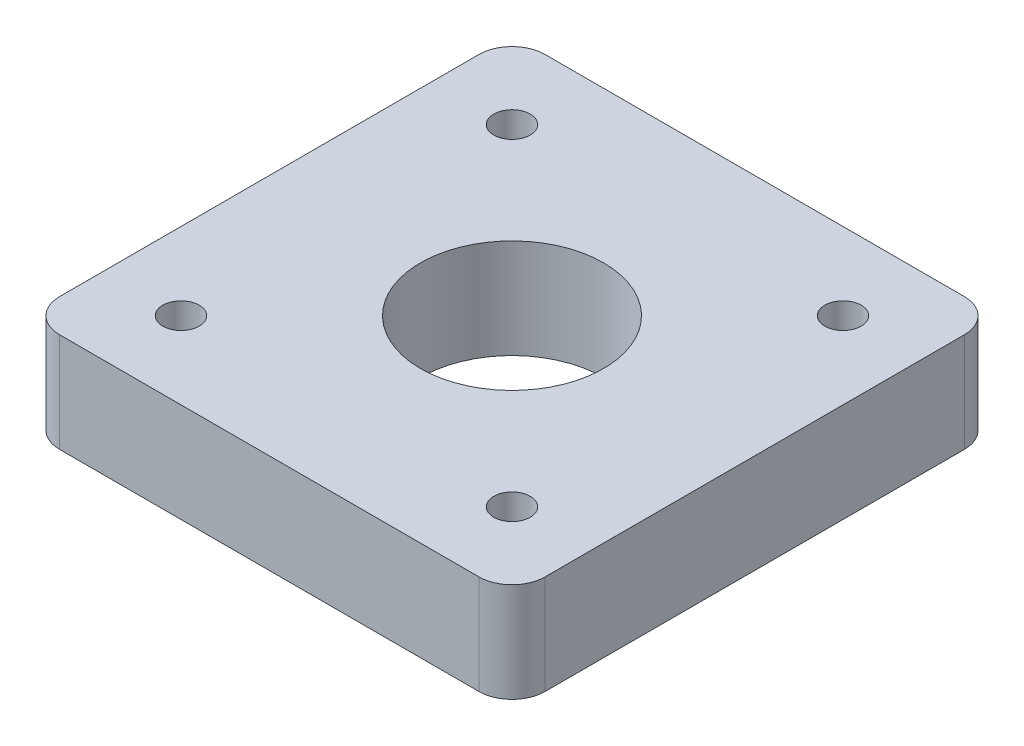
ISO-10303-21;
HEADER;
FILE_DESCRIPTION(('STEP AP214'),'2;1');
FILE_NAME('part.step','',(''),(''),'','','');
FILE_SCHEMA(('AUTOMOTIVE_DESIGN { 1 0 10303 214 1 1 1 1 }'));
ENDSEC;
DATA;
#1=APPLICATION_CONTEXT('core data for automotive mechanical design processes');
#2=APPLICATION_PROTOCOL_DEFINITION('international standard','automotive_design',2000,#1);
#3=PRODUCT_CONTEXT('',#1,'mechanical');
#4=PRODUCT('Part','Part','',(#3));
#5=PRODUCT_RELATED_PRODUCT_CATEGORY('part','',(#4));
#6=PRODUCT_DEFINITION_FORMATION('','',#4);
#7=PRODUCT_DEFINITION_CONTEXT('part definition',#1,'design');
#8=PRODUCT_DEFINITION('design','',#6,#7);
#9=PRODUCT_DEFINITION_SHAPE('','',#8);
#10=(LENGTH_UNIT() NAMED_UNIT(*) SI_UNIT(.MILLI.,.METRE.));
#11=(NAMED_UNIT(*) PLANE_ANGLE_UNIT() SI_UNIT($,.RADIAN.));
#12=(NAMED_UNIT(*) SI_UNIT($,.STERADIAN.) SOLID_ANGLE_UNIT());
#13=UNCERTAINTY_MEASURE_WITH_UNIT(LENGTH_MEASURE(1.E-05),#10,'distance_accuracy_value','');
#14=(GEOMETRIC_REPRESENTATION_CONTEXT(3) GLOBAL_UNCERTAINTY_ASSIGNED_CONTEXT((#13)) GLOBAL_UNIT_ASSIGNED_CONTEXT((#10,
#11,#12)) REPRESENTATION_CONTEXT('',''));
#15=CARTESIAN_POINT('',(0.,0.,0.));
#16=DIRECTION('',(0.,0.,1.));
#17=DIRECTION('',(1.,0.,0.));
#18=AXIS2_PLACEMENT_3D('',#15,#16,#17);
#19=CARTESIAN_POINT('',(0.,9.,44.));
#20=DIRECTION('',(1.,0.,0.));
#21=DIRECTION('',(0.,0.,-1.));
#22=AXIS2_PLACEMENT_3D('',#19,#20,#21);
#23=PLANE('',#22);
#24=DIRECTION('',(0.,0.,-1.));
#25=VECTOR('',#24,1.);
#26=CARTESIAN_POINT('',(0.,9.,44.));
#27=LINE('',#26,#25);
#28=CARTESIAN_POINT('',(0.,9.,41.));
#29=VERTEX_POINT('',#28);
#30=CARTESIAN_POINT('',(0.,9.,3.));
#31=VERTEX_POINT('',#30);
#32=EDGE_CURVE('E160',#29,#31,#27,.T.);
#33=ORIENTED_EDGE('',*,*,#32,.T.);
#34=DIRECTION('',(0.,-1.,0.));
#35=VECTOR('',#34,1.);
#36=CARTESIAN_POINT('',(0.,9.,3.));
#37=LINE('',#36,#35);
#38=CARTESIAN_POINT('',(0.,0.,3.));
#39=VERTEX_POINT('',#38);
#40=EDGE_CURVE('E124',#31,#39,#37,.T.);
#41=ORIENTED_EDGE('',*,*,#40,.T.);
#42=DIRECTION('',(0.,0.,-1.));
#43=VECTOR('',#42,1.);
#44=CARTESIAN_POINT('',(0.,0.,44.));
#45=LINE('',#44,#43);
#46=CARTESIAN_POINT('',(0.,0.,41.));
#47=VERTEX_POINT('',#46);
#48=EDGE_CURVE('E109',#47,#39,#45,.T.);
#49=ORIENTED_EDGE('',*,*,#48,.F.);
#50=DIRECTION('',(0.,-1.,0.));
#51=VECTOR('',#50,1.);
#52=CARTESIAN_POINT('',(0.,9.,41.));
#53=LINE('',#52,#51);
#54=EDGE_CURVE('E121',#47,#29,#53,.F.);
#55=ORIENTED_EDGE('',*,*,#54,.T.);
#56=EDGE_LOOP('',(#33,#41,#49,#55));
#57=FACE_BOUND('',#56,.T.);
#58=ADVANCED_FACE('F39',(#57),#23,.F.);
#59=CARTESIAN_POINT('',(0.,0.,44.));
#60=DIRECTION('',(0.,1.,0.));
#61=DIRECTION('',(0.,0.,1.));
#62=AXIS2_PLACEMENT_3D('',#59,#60,#61);
#63=PLANE('',#62);
#64=CARTESIAN_POINT('',(37.,0.,37.));
#65=DIRECTION('',(0.,1.,0.));
#66=DIRECTION('',(0.,0.,1.));
#67=AXIS2_PLACEMENT_3D('',#64,#65,#66);
#68=CIRCLE('',#67,1.65);
#69=CARTESIAN_POINT('',(37.,0.,38.65));
#70=VERTEX_POINT('',#69);
#71=EDGE_CURVE('E351',#70,#70,#68,.T.);
#72=ORIENTED_EDGE('',*,*,#71,.T.);
#73=EDGE_LOOP('',(#72));
#74=FACE_BOUND('',#73,.T.);
#75=CARTESIAN_POINT('',(37.,0.,7.));
#76=DIRECTION('',(0.,1.,0.));
#77=DIRECTION('',(0.,0.,1.));
#78=AXIS2_PLACEMENT_3D('',#75,#76,#77);
#79=CIRCLE('',#78,1.65);
#80=CARTESIAN_POINT('',(37.,0.,8.65));
#81=VERTEX_POINT('',#80);
#82=EDGE_CURVE('E359',#81,#81,#79,.T.);
#83=ORIENTED_EDGE('',*,*,#82,.T.);
#84=EDGE_LOOP('',(#83));
#85=FACE_BOUND('',#84,.T.);
#86=CARTESIAN_POINT('',(7.,0.,37.));
#87=DIRECTION('',(0.,1.,0.));
#88=DIRECTION('',(0.,0.,1.));
#89=AXIS2_PLACEMENT_3D('',#86,#87,#88);
#90=CIRCLE('',#89,1.65);
#91=CARTESIAN_POINT('',(7.,0.,38.65));
#92=VERTEX_POINT('',#91);
#93=EDGE_CURVE('E365',#92,#92,#90,.T.);
#94=ORIENTED_EDGE('',*,*,#93,.T.);
#95=EDGE_LOOP('',(#94));
#96=FACE_BOUND('',#95,.T.);
#97=CARTESIAN_POINT('',(7.,0.,7.));
#98=DIRECTION('',(0.,1.,0.));
#99=DIRECTION('',(0.,0.,1.));
#100=AXIS2_PLACEMENT_3D('',#97,#98,#99);
#101=CIRCLE('',#100,1.65);
#102=CARTESIAN_POINT('',(7.,0.,8.65));
#103=VERTEX_POINT('',#102);
#104=EDGE_CURVE('E371',#103,#103,#101,.T.);
#105=ORIENTED_EDGE('',*,*,#104,.T.);
#106=EDGE_LOOP('',(#105));
#107=FACE_BOUND('',#106,.T.);
#108=CARTESIAN_POINT('',(22.,0.,22.));
#109=DIRECTION('',(0.,1.,0.));
#110=DIRECTION('',(0.,0.,1.));
#111=AXIS2_PLACEMENT_3D('',#108,#109,#110);
#112=CIRCLE('',#111,8.3);
#113=CARTESIAN_POINT('',(22.,0.,30.3));
#114=VERTEX_POINT('',#113);
#115=EDGE_CURVE('E171',#114,#114,#112,.T.);
#116=ORIENTED_EDGE('',*,*,#115,.T.);
#117=EDGE_LOOP('',(#116));
#118=FACE_BOUND('',#117,.T.);
#119=ORIENTED_EDGE('',*,*,#48,.T.);
#120=CARTESIAN_POINT('',(3.,0.,3.));
#121=DIRECTION('',(0.,1.,0.));
#122=DIRECTION('',(0.,0.,1.));
#123=AXIS2_PLACEMENT_3D('',#120,#121,#122);
#124=CIRCLE('',#123,3.);
#125=CARTESIAN_POINT('',(3.,0.,0.));
#126=VERTEX_POINT('',#125);
#127=EDGE_CURVE('E136',#39,#126,#124,.F.);
#128=ORIENTED_EDGE('',*,*,#127,.T.);
#129=DIRECTION('',(1.,0.,0.));
#130=VECTOR('',#129,1.);
#131=CARTESIAN_POINT('',(0.,0.,0.));
#132=LINE('',#131,#130);
#133=CARTESIAN_POINT('',(41.,0.,0.));
#134=VERTEX_POINT('',#133);
#135=EDGE_CURVE('E168',#126,#134,#132,.T.);
#136=ORIENTED_EDGE('',*,*,#135,.T.);
#137=CARTESIAN_POINT('',(41.,0.,3.));
#138=DIRECTION('',(0.,1.,0.));
#139=DIRECTION('',(0.,0.,1.));
#140=AXIS2_PLACEMENT_3D('',#137,#138,#139);
#141=CIRCLE('',#140,3.);
#142=CARTESIAN_POINT('',(44.,0.,3.));
#143=VERTEX_POINT('',#142);
#144=EDGE_CURVE('E115',#134,#143,#141,.F.);
#145=ORIENTED_EDGE('',*,*,#144,.T.);
#146=DIRECTION('',(0.,0.,-1.));
#147=VECTOR('',#146,1.);
#148=CARTESIAN_POINT('',(44.,0.,44.));
#149=LINE('',#148,#147);
#150=CARTESIAN_POINT('',(44.,0.,41.));
#151=VERTEX_POINT('',#150);
#152=EDGE_CURVE('E125',#151,#143,#149,.T.);
#153=ORIENTED_EDGE('',*,*,#152,.F.);
#154=CARTESIAN_POINT('',(41.,0.,41.));
#155=DIRECTION('',(0.,1.,0.));
#156=DIRECTION('',(0.,0.,1.));
#157=AXIS2_PLACEMENT_3D('',#154,#155,#156);
#158=CIRCLE('',#157,3.);
#159=CARTESIAN_POINT('',(41.,0.,44.));
#160=VERTEX_POINT('',#159);
#161=EDGE_CURVE('E116',#151,#160,#158,.F.);
#162=ORIENTED_EDGE('',*,*,#161,.T.);
#163=DIRECTION('',(1.,0.,0.));
#164=VECTOR('',#163,1.);
#165=CARTESIAN_POINT('',(0.,0.,44.));
#166=LINE('',#165,#164);
#167=CARTESIAN_POINT('',(3.,0.,44.));
#168=VERTEX_POINT('',#167);
#169=EDGE_CURVE('E111',#168,#160,#166,.T.);
#170=ORIENTED_EDGE('',*,*,#169,.F.);
#171=CARTESIAN_POINT('',(3.,0.,41.));
#172=DIRECTION('',(0.,1.,0.));
#173=DIRECTION('',(0.,0.,1.));
#174=AXIS2_PLACEMENT_3D('',#171,#172,#173);
#175=CIRCLE('',#174,3.);
#176=EDGE_CURVE('E106',#168,#47,#175,.F.);
#177=ORIENTED_EDGE('',*,*,#176,.T.);
#178=EDGE_LOOP('',(#119,#128,#136,#145,#153,#162,#170,#177));
#179=FACE_BOUND('',#178,.T.);
#180=ADVANCED_FACE('F108',(#74,#85,#96,#107,#118,#179),#63,.F.);
#181=CARTESIAN_POINT('',(44.,0.,44.));
#182=DIRECTION('',(-1.,0.,0.));
#183=DIRECTION('',(0.,0.,1.));
#184=AXIS2_PLACEMENT_3D('',#181,#182,#183);
#185=PLANE('',#184);
#186=ORIENTED_EDGE('',*,*,#152,.T.);
#187=DIRECTION('',(0.,1.,0.));
#188=VECTOR('',#187,1.);
#189=CARTESIAN_POINT('',(44.,0.,3.));
#190=LINE('',#189,#188);
#191=CARTESIAN_POINT('',(44.,9.,3.));
#192=VERTEX_POINT('',#191);
#193=EDGE_CURVE('E149',#143,#192,#190,.T.);
#194=ORIENTED_EDGE('',*,*,#193,.T.);
#195=DIRECTION('',(0.,0.,-1.));
#196=VECTOR('',#195,1.);
#197=CARTESIAN_POINT('',(44.,9.,44.));
#198=LINE('',#197,#196);
#199=CARTESIAN_POINT('',(44.,9.,41.));
#200=VERTEX_POINT('',#199);
#201=EDGE_CURVE('E162',#200,#192,#198,.T.);
#202=ORIENTED_EDGE('',*,*,#201,.F.);
#203=DIRECTION('',(0.,1.,0.));
#204=VECTOR('',#203,1.);
#205=CARTESIAN_POINT('',(44.,0.,41.));
#206=LINE('',#205,#204);
#207=EDGE_CURVE('E147',#200,#151,#206,.F.);
#208=ORIENTED_EDGE('',*,*,#207,.T.);
#209=EDGE_LOOP('',(#186,#194,#202,#208));
#210=FACE_BOUND('',#209,.T.);
#211=ADVANCED_FACE('F176',(#210),#185,.F.);
#212=CARTESIAN_POINT('',(44.,9.,44.));
#213=DIRECTION('',(0.,-1.,0.));
#214=DIRECTION('',(0.,0.,-1.));
#215=AXIS2_PLACEMENT_3D('',#212,#213,#214);
#216=PLANE('',#215);
#217=CARTESIAN_POINT('',(37.,9.,37.));
#218=DIRECTION('',(0.,1.,0.));
#219=DIRECTION('',(0.,0.,1.));
#220=AXIS2_PLACEMENT_3D('',#217,#218,#219);
#221=CIRCLE('',#220,1.65);
#222=CARTESIAN_POINT('',(37.,9.,38.65));
#223=VERTEX_POINT('',#222);
#224=EDGE_CURVE('E354',#223,#223,#221,.T.);
#225=ORIENTED_EDGE('',*,*,#224,.F.);
#226=EDGE_LOOP('',(#225));
#227=FACE_BOUND('',#226,.T.);
#228=CARTESIAN_POINT('',(37.,9.,7.));
#229=DIRECTION('',(0.,1.,0.));
#230=DIRECTION('',(0.,0.,1.));
#231=AXIS2_PLACEMENT_3D('',#228,#229,#230);
#232=CIRCLE('',#231,1.65);
#233=CARTESIAN_POINT('',(37.,9.,8.65));
#234=VERTEX_POINT('',#233);
#235=EDGE_CURVE('E356',#234,#234,#232,.T.);
#236=ORIENTED_EDGE('',*,*,#235,.F.);
#237=EDGE_LOOP('',(#236));
#238=FACE_BOUND('',#237,.T.);
#239=CARTESIAN_POINT('',(7.,9.,37.));
#240=DIRECTION('',(0.,1.,0.));
#241=DIRECTION('',(0.,0.,1.));
#242=AXIS2_PLACEMENT_3D('',#239,#240,#241);
#243=CIRCLE('',#242,1.65);
#244=CARTESIAN_POINT('',(7.,9.,38.65));
#245=VERTEX_POINT('',#244);
#246=EDGE_CURVE('E362',#245,#245,#243,.T.);
#247=ORIENTED_EDGE('',*,*,#246,.F.);
#248=EDGE_LOOP('',(#247));
#249=FACE_BOUND('',#248,.T.);
#250=CARTESIAN_POINT('',(7.,9.,7.));
#251=DIRECTION('',(0.,1.,0.));
#252=DIRECTION('',(0.,0.,1.));
#253=AXIS2_PLACEMENT_3D('',#250,#251,#252);
#254=CIRCLE('',#253,1.65);
#255=CARTESIAN_POINT('',(7.,9.,8.65));
#256=VERTEX_POINT('',#255);
#257=EDGE_CURVE('E368',#256,#256,#254,.T.);
#258=ORIENTED_EDGE('',*,*,#257,.F.);
#259=EDGE_LOOP('',(#258));
#260=FACE_BOUND('',#259,.T.);
#261=CARTESIAN_POINT('',(22.,9.,22.));
#262=DIRECTION('',(0.,1.,0.));
#263=DIRECTION('',(0.,0.,1.));
#264=AXIS2_PLACEMENT_3D('',#261,#262,#263);
#265=CIRCLE('',#264,8.3);
#266=CARTESIAN_POINT('',(22.,9.,30.3));
#267=VERTEX_POINT('',#266);
#268=EDGE_CURVE('E374',#267,#267,#265,.T.);
#269=ORIENTED_EDGE('',*,*,#268,.F.);
#270=EDGE_LOOP('',(#269));
#271=FACE_BOUND('',#270,.T.);
#272=DIRECTION('',(-1.,0.,0.));
#273=VECTOR('',#272,1.);
#274=CARTESIAN_POINT('',(44.,9.,0.));
#275=LINE('',#274,#273);
#276=CARTESIAN_POINT('',(41.,9.,0.));
#277=VERTEX_POINT('',#276);
#278=CARTESIAN_POINT('',(3.,9.,0.));
#279=VERTEX_POINT('',#278);
#280=EDGE_CURVE('E164',#277,#279,#275,.T.);
#281=ORIENTED_EDGE('',*,*,#280,.T.);
#282=CARTESIAN_POINT('',(3.,9.,3.));
#283=DIRECTION('',(0.,-1.,0.));
#284=DIRECTION('',(0.,0.,-1.));
#285=AXIS2_PLACEMENT_3D('',#282,#283,#284);
#286=CIRCLE('',#285,3.);
#287=EDGE_CURVE('E145',#279,#31,#286,.F.);
#288=ORIENTED_EDGE('',*,*,#287,.T.);
#289=ORIENTED_EDGE('',*,*,#32,.F.);
#290=CARTESIAN_POINT('',(3.,9.,41.));
#291=DIRECTION('',(0.,-1.,0.));
#292=DIRECTION('',(0.,0.,-1.));
#293=AXIS2_PLACEMENT_3D('',#290,#291,#292);
#294=CIRCLE('',#293,3.);
#295=CARTESIAN_POINT('',(3.,9.,44.));
#296=VERTEX_POINT('',#295);
#297=EDGE_CURVE('E129',#29,#296,#294,.F.);
#298=ORIENTED_EDGE('',*,*,#297,.T.);
#299=DIRECTION('',(-1.,0.,0.));
#300=VECTOR('',#299,1.);
#301=CARTESIAN_POINT('',(44.,9.,44.));
#302=LINE('',#301,#300);
#303=CARTESIAN_POINT('',(41.,9.,44.));
#304=VERTEX_POINT('',#303);
#305=EDGE_CURVE('E155',#304,#296,#302,.T.);
#306=ORIENTED_EDGE('',*,*,#305,.F.);
#307=CARTESIAN_POINT('',(41.,9.,41.));
#308=DIRECTION('',(0.,-1.,0.));
#309=DIRECTION('',(0.,0.,-1.));
#310=AXIS2_PLACEMENT_3D('',#307,#308,#309);
#311=CIRCLE('',#310,3.);
#312=EDGE_CURVE('E62',#304,#200,#311,.F.);
#313=ORIENTED_EDGE('',*,*,#312,.T.);
#314=ORIENTED_EDGE('',*,*,#201,.T.);
#315=CARTESIAN_POINT('',(41.,9.,3.));
#316=DIRECTION('',(0.,-1.,0.));
#317=DIRECTION('',(0.,0.,-1.));
#318=AXIS2_PLACEMENT_3D('',#315,#316,#317);
#319=CIRCLE('',#318,3.);
#320=EDGE_CURVE('E54',#192,#277,#319,.F.);
#321=ORIENTED_EDGE('',*,*,#320,.T.);
#322=EDGE_LOOP('',(#281,#288,#289,#298,#306,#313,#314,#321));
#323=FACE_BOUND('',#322,.T.);
#324=ADVANCED_FACE('F159',(#227,#238,#249,#260,#271,#323),#216,.F.);
#325=CARTESIAN_POINT('',(0.,0.,44.));
#326=DIRECTION('',(0.,0.,1.));
#327=DIRECTION('',(1.,0.,0.));
#328=AXIS2_PLACEMENT_3D('',#325,#326,#327);
#329=PLANE('',#328);
#330=ORIENTED_EDGE('',*,*,#305,.T.);
#331=DIRECTION('',(0.,-1.,0.));
#332=VECTOR('',#331,1.);
#333=CARTESIAN_POINT('',(3.,0.,44.));
#334=LINE('',#333,#332);
#335=EDGE_CURVE('E11',#296,#168,#334,.T.);
#336=ORIENTED_EDGE('',*,*,#335,.T.);
#337=ORIENTED_EDGE('',*,*,#169,.T.);
#338=DIRECTION('',(0.,1.,0.));
#339=VECTOR('',#338,1.);
#340=CARTESIAN_POINT('',(41.,9.,44.));
#341=LINE('',#340,#339);
#342=EDGE_CURVE('E47',#160,#304,#341,.T.);
#343=ORIENTED_EDGE('',*,*,#342,.T.);
#344=EDGE_LOOP('',(#330,#336,#337,#343));
#345=FACE_BOUND('',#344,.T.);
#346=ADVANCED_FACE('F154',(#345),#329,.T.);
#347=CARTESIAN_POINT('',(0.,0.,0.));
#348=DIRECTION('',(0.,0.,1.));
#349=DIRECTION('',(1.,0.,0.));
#350=AXIS2_PLACEMENT_3D('',#347,#348,#349);
#351=PLANE('',#350);
#352=ORIENTED_EDGE('',*,*,#135,.F.);
#353=DIRECTION('',(0.,-1.,0.));
#354=VECTOR('',#353,1.);
#355=CARTESIAN_POINT('',(3.,0.,0.));
#356=LINE('',#355,#354);
#357=EDGE_CURVE('E140',#126,#279,#356,.F.);
#358=ORIENTED_EDGE('',*,*,#357,.T.);
#359=ORIENTED_EDGE('',*,*,#280,.F.);
#360=DIRECTION('',(0.,1.,0.));
#361=VECTOR('',#360,1.);
#362=CARTESIAN_POINT('',(41.,0.,0.));
#363=LINE('',#362,#361);
#364=EDGE_CURVE('E138',#277,#134,#363,.F.);
#365=ORIENTED_EDGE('',*,*,#364,.T.);
#366=EDGE_LOOP('',(#352,#358,#359,#365));
#367=FACE_BOUND('',#366,.T.);
#368=ADVANCED_FACE('F183',(#367),#351,.F.);
#369=CARTESIAN_POINT('',(3.,9.,3.));
#370=DIRECTION('',(0.,-1.,0.));
#371=DIRECTION('',(0.,0.,-1.));
#372=AXIS2_PLACEMENT_3D('',#369,#370,#371);
#373=CYLINDRICAL_SURFACE('',#372,3.);
#374=ORIENTED_EDGE('',*,*,#287,.F.);
#375=ORIENTED_EDGE('',*,*,#357,.F.);
#376=ORIENTED_EDGE('',*,*,#127,.F.);
#377=ORIENTED_EDGE('',*,*,#40,.F.);
#378=EDGE_LOOP('',(#374,#375,#376,#377));
#379=FACE_BOUND('',#378,.T.);
#380=ADVANCED_FACE('F187',(#379),#373,.T.);
#381=CARTESIAN_POINT('',(41.,0.,3.));
#382=DIRECTION('',(0.,1.,0.));
#383=DIRECTION('',(0.,0.,1.));
#384=AXIS2_PLACEMENT_3D('',#381,#382,#383);
#385=CYLINDRICAL_SURFACE('',#384,3.);
#386=ORIENTED_EDGE('',*,*,#144,.F.);
#387=ORIENTED_EDGE('',*,*,#364,.F.);
#388=ORIENTED_EDGE('',*,*,#320,.F.);
#389=ORIENTED_EDGE('',*,*,#193,.F.);
#390=EDGE_LOOP('',(#386,#387,#388,#389));
#391=FACE_BOUND('',#390,.T.);
#392=ADVANCED_FACE('F179',(#391),#385,.T.);
#393=CARTESIAN_POINT('',(3.,0.,41.));
#394=DIRECTION('',(0.,1.,0.));
#395=DIRECTION('',(0.,0.,1.));
#396=AXIS2_PLACEMENT_3D('',#393,#394,#395);
#397=CYLINDRICAL_SURFACE('',#396,3.);
#398=ORIENTED_EDGE('',*,*,#297,.F.);
#399=ORIENTED_EDGE('',*,*,#54,.F.);
#400=ORIENTED_EDGE('',*,*,#176,.F.);
#401=ORIENTED_EDGE('',*,*,#335,.F.);
#402=EDGE_LOOP('',(#398,#399,#400,#401));
#403=FACE_BOUND('',#402,.T.);
#404=ADVANCED_FACE('F128',(#403),#397,.T.);
#405=CARTESIAN_POINT('',(41.,0.,41.));
#406=DIRECTION('',(0.,-1.,0.));
#407=DIRECTION('',(0.,0.,-1.));
#408=AXIS2_PLACEMENT_3D('',#405,#406,#407);
#409=CYLINDRICAL_SURFACE('',#408,3.);
#410=ORIENTED_EDGE('',*,*,#161,.F.);
#411=ORIENTED_EDGE('',*,*,#207,.F.);
#412=ORIENTED_EDGE('',*,*,#312,.F.);
#413=ORIENTED_EDGE('',*,*,#342,.F.);
#414=EDGE_LOOP('',(#410,#411,#412,#413));
#415=FACE_BOUND('',#414,.T.);
#416=ADVANCED_FACE('F41',(#415),#409,.T.);
#417=CARTESIAN_POINT('',(22.,0.,22.));
#418=DIRECTION('',(0.,1.,0.));
#419=DIRECTION('',(0.,0.,1.));
#420=AXIS2_PLACEMENT_3D('',#417,#418,#419);
#421=CYLINDRICAL_SURFACE('',#420,8.3);
#422=ORIENTED_EDGE('',*,*,#115,.F.);
#423=EDGE_LOOP('',(#422));
#424=FACE_BOUND('',#423,.T.);
#425=ORIENTED_EDGE('',*,*,#268,.T.);
#426=EDGE_LOOP('',(#425));
#427=FACE_BOUND('',#426,.T.);
#428=ADVANCED_FACE('F189',(#424,#427),#421,.F.);
#429=CARTESIAN_POINT('',(7.,0.,7.));
#430=DIRECTION('',(0.,1.,0.));
#431=DIRECTION('',(0.,0.,1.));
#432=AXIS2_PLACEMENT_3D('',#429,#430,#431);
#433=CYLINDRICAL_SURFACE('',#432,1.65);
#434=ORIENTED_EDGE('',*,*,#104,.F.);
#435=EDGE_LOOP('',(#434));
#436=FACE_BOUND('',#435,.T.);
#437=ORIENTED_EDGE('',*,*,#257,.T.);
#438=EDGE_LOOP('',(#437));
#439=FACE_BOUND('',#438,.T.);
#440=ADVANCED_FACE('F194',(#436,#439),#433,.F.);
#441=CARTESIAN_POINT('',(7.,0.,37.));
#442=DIRECTION('',(0.,1.,0.));
#443=DIRECTION('',(0.,0.,1.));
#444=AXIS2_PLACEMENT_3D('',#441,#442,#443);
#445=CYLINDRICAL_SURFACE('',#444,1.65);
#446=ORIENTED_EDGE('',*,*,#93,.F.);
#447=EDGE_LOOP('',(#446));
#448=FACE_BOUND('',#447,.T.);
#449=ORIENTED_EDGE('',*,*,#246,.T.);
#450=EDGE_LOOP('',(#449));
#451=FACE_BOUND('',#450,.T.);
#452=ADVANCED_FACE('F240',(#448,#451),#445,.F.);
#453=CARTESIAN_POINT('',(37.,0.,7.));
#454=DIRECTION('',(0.,1.,0.));
#455=DIRECTION('',(0.,0.,1.));
#456=AXIS2_PLACEMENT_3D('',#453,#454,#455);
#457=CYLINDRICAL_SURFACE('',#456,1.65);
#458=ORIENTED_EDGE('',*,*,#82,.F.);
#459=EDGE_LOOP('',(#458));
#460=FACE_BOUND('',#459,.T.);
#461=ORIENTED_EDGE('',*,*,#235,.T.);
#462=EDGE_LOOP('',(#461));
#463=FACE_BOUND('',#462,.T.);
#464=ADVANCED_FACE('F251',(#460,#463),#457,.F.);
#465=CARTESIAN_POINT('',(37.,0.,37.));
#466=DIRECTION('',(0.,1.,0.));
#467=DIRECTION('',(0.,0.,1.));
#468=AXIS2_PLACEMENT_3D('',#465,#466,#467);
#469=CYLINDRICAL_SURFACE('',#468,1.65);
#470=ORIENTED_EDGE('',*,*,#71,.F.);
#471=EDGE_LOOP('',(#470));
#472=FACE_BOUND('',#471,.T.);
#473=ORIENTED_EDGE('',*,*,#224,.T.);
#474=EDGE_LOOP('',(#473));
#475=FACE_BOUND('',#474,.T.);
#476=ADVANCED_FACE('F262',(#472,#475),#469,.F.);
#477=CLOSED_SHELL('',(#58,#180,#211,#324,#346,#368,#380,#392,#404,#416,#428,#440,#452,#464,#476));
#478=MANIFOLD_SOLID_BREP('B2',#477);
#479=ADVANCED_BREP_SHAPE_REPRESENTATION('',(#18,#478),#14);
#480=SHAPE_DEFINITION_REPRESENTATION(#9,#479);
ENDSEC;
END-ISO-10303-21;
